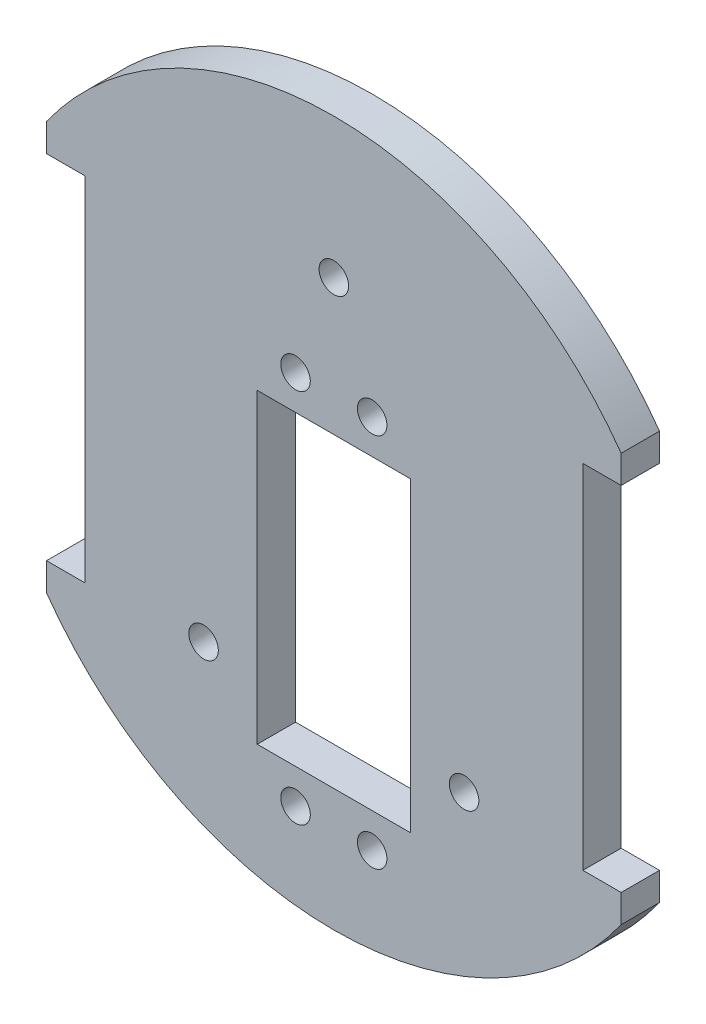
ISO-10303-21;
HEADER;
FILE_DESCRIPTION(('STEP AP214'),'2;1');
FILE_NAME('part.step','',(''),(''),'','','');
FILE_SCHEMA(('AUTOMOTIVE_DESIGN { 1 0 10303 214 1 1 1 1 }'));
ENDSEC;
DATA;
#1=APPLICATION_CONTEXT('core data for automotive mechanical design processes');
#2=APPLICATION_PROTOCOL_DEFINITION('international standard','automotive_design',2000,#1);
#3=PRODUCT_CONTEXT('',#1,'mechanical');
#4=PRODUCT('Part','Part','',(#3));
#5=PRODUCT_RELATED_PRODUCT_CATEGORY('part','',(#4));
#6=PRODUCT_DEFINITION_FORMATION('','',#4);
#7=PRODUCT_DEFINITION_CONTEXT('part definition',#1,'design');
#8=PRODUCT_DEFINITION('design','',#6,#7);
#9=PRODUCT_DEFINITION_SHAPE('','',#8);
#10=(LENGTH_UNIT() NAMED_UNIT(*) SI_UNIT(.MILLI.,.METRE.));
#11=(NAMED_UNIT(*) PLANE_ANGLE_UNIT() SI_UNIT($,.RADIAN.));
#12=(NAMED_UNIT(*) SI_UNIT($,.STERADIAN.) SOLID_ANGLE_UNIT());
#13=UNCERTAINTY_MEASURE_WITH_UNIT(LENGTH_MEASURE(1.E-05),#10,'distance_accuracy_value','');
#14=(GEOMETRIC_REPRESENTATION_CONTEXT(3) GLOBAL_UNCERTAINTY_ASSIGNED_CONTEXT((#13)) GLOBAL_UNIT_ASSIGNED_CONTEXT((#10,
#11,#12)) REPRESENTATION_CONTEXT('',''));
#15=CARTESIAN_POINT('',(0.,0.,0.));
#16=DIRECTION('',(0.,0.,1.));
#17=DIRECTION('',(1.,0.,0.));
#18=AXIS2_PLACEMENT_3D('',#15,#16,#17);
#19=CARTESIAN_POINT('',(0.,0.,0.));
#20=DIRECTION('',(0.,0.,1.));
#21=DIRECTION('',(1.,0.,0.));
#22=AXIS2_PLACEMENT_3D('',#19,#20,#21);
#23=PLANE('',#22);
#24=DIRECTION('',(1.,0.,0.));
#25=VECTOR('',#24,1.);
#26=CARTESIAN_POINT('',(10.,-30.,0.));
#27=LINE('',#26,#25);
#28=CARTESIAN_POINT('',(-10.,-30.,0.));
#29=VERTEX_POINT('',#28);
#30=CARTESIAN_POINT('',(10.,-30.,0.));
#31=VERTEX_POINT('',#30);
#32=EDGE_CURVE('E225',#29,#31,#27,.T.);
#33=ORIENTED_EDGE('',*,*,#32,.T.);
#34=DIRECTION('',(0.,1.,0.));
#35=VECTOR('',#34,1.);
#36=CARTESIAN_POINT('',(10.,10.,0.));
#37=LINE('',#36,#35);
#38=CARTESIAN_POINT('',(10.,10.,0.));
#39=VERTEX_POINT('',#38);
#40=EDGE_CURVE('E236',#31,#39,#37,.T.);
#41=ORIENTED_EDGE('',*,*,#40,.T.);
#42=DIRECTION('',(-1.,0.,0.));
#43=VECTOR('',#42,1.);
#44=CARTESIAN_POINT('',(10.,10.,0.));
#45=LINE('',#44,#43);
#46=CARTESIAN_POINT('',(-10.,10.,0.));
#47=VERTEX_POINT('',#46);
#48=EDGE_CURVE('E207',#39,#47,#45,.T.);
#49=ORIENTED_EDGE('',*,*,#48,.T.);
#50=DIRECTION('',(0.,-1.,0.));
#51=VECTOR('',#50,1.);
#52=CARTESIAN_POINT('',(-10.,10.,0.));
#53=LINE('',#52,#51);
#54=EDGE_CURVE('E220',#47,#29,#53,.T.);
#55=ORIENTED_EDGE('',*,*,#54,.T.);
#56=EDGE_LOOP('',(#33,#41,#49,#55));
#57=FACE_BOUND('',#56,.T.);
#58=DIRECTION('',(0.,1.,0.));
#59=VECTOR('',#58,1.);
#60=CARTESIAN_POINT('',(-32.5,23.,0.));
#61=LINE('',#60,#59);
#62=CARTESIAN_POINT('',(-32.5,23.,0.));
#63=VERTEX_POINT('',#62);
#64=CARTESIAN_POINT('',(-32.5,-23.,0.));
#65=VERTEX_POINT('',#64);
#66=EDGE_CURVE('E329',#63,#65,#61,.F.);
#67=ORIENTED_EDGE('',*,*,#66,.F.);
#68=DIRECTION('',(1.,0.,0.));
#69=VECTOR('',#68,1.);
#70=CARTESIAN_POINT('',(-32.5,23.,0.));
#71=LINE('',#70,#69);
#72=CARTESIAN_POINT('',(-37.5,23.,0.));
#73=VERTEX_POINT('',#72);
#74=EDGE_CURVE('E246',#73,#63,#71,.T.);
#75=ORIENTED_EDGE('',*,*,#74,.F.);
#76=DIRECTION('',(0.,1.,0.));
#77=VECTOR('',#76,1.);
#78=CARTESIAN_POINT('',(-37.5,35.,0.));
#79=LINE('',#78,#77);
#80=CARTESIAN_POINT('',(-37.5,26.6411336095144,0.));
#81=VERTEX_POINT('',#80);
#82=EDGE_CURVE('E239',#73,#81,#79,.T.);
#83=ORIENTED_EDGE('',*,*,#82,.T.);
#84=CARTESIAN_POINT('',(0.,0.,0.));
#85=DIRECTION('',(0.,0.,-1.));
#86=DIRECTION('',(-1.,0.,0.));
#87=AXIS2_PLACEMENT_3D('',#84,#85,#86);
#88=CIRCLE('',#87,46.);
#89=CARTESIAN_POINT('',(37.5,26.6411336095144,0.));
#90=VERTEX_POINT('',#89);
#91=EDGE_CURVE('E330',#90,#81,#88,.F.);
#92=ORIENTED_EDGE('',*,*,#91,.F.);
#93=DIRECTION('',(0.,-1.,0.));
#94=VECTOR('',#93,1.);
#95=CARTESIAN_POINT('',(37.5,35.,0.));
#96=LINE('',#95,#94);
#97=CARTESIAN_POINT('',(37.5,23.,0.));
#98=VERTEX_POINT('',#97);
#99=EDGE_CURVE('E251',#90,#98,#96,.T.);
#100=ORIENTED_EDGE('',*,*,#99,.T.);
#101=DIRECTION('',(1.,0.,0.));
#102=VECTOR('',#101,1.);
#103=CARTESIAN_POINT('',(32.5,23.,0.));
#104=LINE('',#103,#102);
#105=CARTESIAN_POINT('',(32.5,23.,0.));
#106=VERTEX_POINT('',#105);
#107=EDGE_CURVE('E254',#98,#106,#104,.F.);
#108=ORIENTED_EDGE('',*,*,#107,.T.);
#109=DIRECTION('',(0.,1.,0.));
#110=VECTOR('',#109,1.);
#111=CARTESIAN_POINT('',(32.5,23.,0.));
#112=LINE('',#111,#110);
#113=CARTESIAN_POINT('',(32.5,-23.,0.));
#114=VERTEX_POINT('',#113);
#115=EDGE_CURVE('E262',#106,#114,#112,.F.);
#116=ORIENTED_EDGE('',*,*,#115,.T.);
#117=DIRECTION('',(1.,0.,0.));
#118=VECTOR('',#117,1.);
#119=CARTESIAN_POINT('',(32.5,-23.,0.));
#120=LINE('',#119,#118);
#121=CARTESIAN_POINT('',(37.5,-23.,0.));
#122=VERTEX_POINT('',#121);
#123=EDGE_CURVE('E162',#114,#122,#120,.T.);
#124=ORIENTED_EDGE('',*,*,#123,.T.);
#125=DIRECTION('',(0.,-1.,0.));
#126=VECTOR('',#125,1.);
#127=CARTESIAN_POINT('',(37.5,35.,0.));
#128=LINE('',#127,#126);
#129=CARTESIAN_POINT('',(37.5,-26.6411336095144,0.));
#130=VERTEX_POINT('',#129);
#131=EDGE_CURVE('E158',#122,#130,#128,.T.);
#132=ORIENTED_EDGE('',*,*,#131,.T.);
#133=CARTESIAN_POINT('',(0.,0.,0.));
#134=DIRECTION('',(0.,0.,-1.));
#135=DIRECTION('',(-1.,0.,0.));
#136=AXIS2_PLACEMENT_3D('',#133,#134,#135);
#137=CIRCLE('',#136,46.);
#138=CARTESIAN_POINT('',(-37.5,-26.6411336095145,0.));
#139=VERTEX_POINT('',#138);
#140=EDGE_CURVE('E147',#139,#130,#137,.F.);
#141=ORIENTED_EDGE('',*,*,#140,.F.);
#142=DIRECTION('',(0.,1.,0.));
#143=VECTOR('',#142,1.);
#144=CARTESIAN_POINT('',(-37.5,35.,0.));
#145=LINE('',#144,#143);
#146=CARTESIAN_POINT('',(-37.5,-23.,0.));
#147=VERTEX_POINT('',#146);
#148=EDGE_CURVE('E142',#139,#147,#145,.T.);
#149=ORIENTED_EDGE('',*,*,#148,.T.);
#150=DIRECTION('',(1.,0.,0.));
#151=VECTOR('',#150,1.);
#152=CARTESIAN_POINT('',(-32.5,-23.,0.));
#153=LINE('',#152,#151);
#154=EDGE_CURVE('E200',#65,#147,#153,.F.);
#155=ORIENTED_EDGE('',*,*,#154,.F.);
#156=EDGE_LOOP('',(#67,#75,#83,#92,#100,#108,#116,#124,#132,#141,#149,#155));
#157=FACE_BOUND('',#156,.T.);
#158=CARTESIAN_POINT('',(0.,27.75,0.));
#159=DIRECTION('',(0.,0.,-1.));
#160=DIRECTION('',(-1.,0.,0.));
#161=AXIS2_PLACEMENT_3D('',#158,#159,#160);
#162=CIRCLE('',#161,1.925);
#163=CARTESIAN_POINT('',(-1.925,27.75,0.));
#164=VERTEX_POINT('',#163);
#165=EDGE_CURVE('E320',#164,#164,#162,.F.);
#166=ORIENTED_EDGE('',*,*,#165,.T.);
#167=EDGE_LOOP('',(#166));
#168=FACE_BOUND('',#167,.T.);
#169=CARTESIAN_POINT('',(17.,-21.9331370305299,0.));
#170=DIRECTION('',(0.,0.,-1.));
#171=DIRECTION('',(-1.,0.,0.));
#172=AXIS2_PLACEMENT_3D('',#169,#170,#171);
#173=CIRCLE('',#172,1.925);
#174=CARTESIAN_POINT('',(15.075,-21.9331370305299,0.));
#175=VERTEX_POINT('',#174);
#176=EDGE_CURVE('E323',#175,#175,#173,.F.);
#177=ORIENTED_EDGE('',*,*,#176,.T.);
#178=EDGE_LOOP('',(#177));
#179=FACE_BOUND('',#178,.T.);
#180=CARTESIAN_POINT('',(-17.,-21.9331370305299,0.));
#181=DIRECTION('',(0.,0.,-1.));
#182=DIRECTION('',(-1.,0.,0.));
#183=AXIS2_PLACEMENT_3D('',#180,#181,#182);
#184=CIRCLE('',#183,1.925);
#185=CARTESIAN_POINT('',(-18.925,-21.9331370305299,0.));
#186=VERTEX_POINT('',#185);
#187=EDGE_CURVE('E326',#186,#186,#184,.F.);
#188=ORIENTED_EDGE('',*,*,#187,.T.);
#189=EDGE_LOOP('',(#188));
#190=FACE_BOUND('',#189,.T.);
#191=CARTESIAN_POINT('',(5.,14.5,0.));
#192=DIRECTION('',(0.,0.,-1.));
#193=DIRECTION('',(-1.,0.,0.));
#194=AXIS2_PLACEMENT_3D('',#191,#192,#193);
#195=CIRCLE('',#194,1.925);
#196=CARTESIAN_POINT('',(3.075,14.5,0.));
#197=VERTEX_POINT('',#196);
#198=EDGE_CURVE('E201',#197,#197,#195,.F.);
#199=ORIENTED_EDGE('',*,*,#198,.T.);
#200=EDGE_LOOP('',(#199));
#201=FACE_BOUND('',#200,.T.);
#202=CARTESIAN_POINT('',(-5.,14.5,0.));
#203=DIRECTION('',(0.,0.,-1.));
#204=DIRECTION('',(-1.,0.,0.));
#205=AXIS2_PLACEMENT_3D('',#202,#203,#204);
#206=CIRCLE('',#205,1.925);
#207=CARTESIAN_POINT('',(-6.925,14.5,0.));
#208=VERTEX_POINT('',#207);
#209=EDGE_CURVE('E335',#208,#208,#206,.F.);
#210=ORIENTED_EDGE('',*,*,#209,.T.);
#211=EDGE_LOOP('',(#210));
#212=FACE_BOUND('',#211,.T.);
#213=CARTESIAN_POINT('',(5.,-34.5,0.));
#214=DIRECTION('',(0.,0.,-1.));
#215=DIRECTION('',(-1.,0.,0.));
#216=AXIS2_PLACEMENT_3D('',#213,#214,#215);
#217=CIRCLE('',#216,1.925);
#218=CARTESIAN_POINT('',(3.075,-34.5,0.));
#219=VERTEX_POINT('',#218);
#220=EDGE_CURVE('E338',#219,#219,#217,.F.);
#221=ORIENTED_EDGE('',*,*,#220,.T.);
#222=EDGE_LOOP('',(#221));
#223=FACE_BOUND('',#222,.T.);
#224=CARTESIAN_POINT('',(-5.,-34.5,0.));
#225=DIRECTION('',(0.,0.,-1.));
#226=DIRECTION('',(-1.,0.,0.));
#227=AXIS2_PLACEMENT_3D('',#224,#225,#226);
#228=CIRCLE('',#227,1.925);
#229=CARTESIAN_POINT('',(-6.925,-34.5,0.));
#230=VERTEX_POINT('',#229);
#231=EDGE_CURVE('E283',#230,#230,#228,.F.);
#232=ORIENTED_EDGE('',*,*,#231,.T.);
#233=EDGE_LOOP('',(#232));
#234=FACE_BOUND('',#233,.T.);
#235=ADVANCED_FACE('F33',(#57,#157,#168,#179,#190,#201,#212,#223,#234),#23,.F.);
#236=CARTESIAN_POINT('',(10.,10.,10.));
#237=DIRECTION('',(1.,0.,0.));
#238=DIRECTION('',(0.,1.,0.));
#239=AXIS2_PLACEMENT_3D('',#236,#237,#238);
#240=PLANE('',#239);
#241=DIRECTION('',(0.,0.,1.));
#242=VECTOR('',#241,1.);
#243=CARTESIAN_POINT('',(10.,10.,10.));
#244=LINE('',#243,#242);
#245=CARTESIAN_POINT('',(10.,10.,5.));
#246=VERTEX_POINT('',#245);
#247=EDGE_CURVE('E226',#39,#246,#244,.T.);
#248=ORIENTED_EDGE('',*,*,#247,.F.);
#249=ORIENTED_EDGE('',*,*,#40,.F.);
#250=DIRECTION('',(0.,0.,1.));
#251=VECTOR('',#250,1.);
#252=CARTESIAN_POINT('',(10.,-30.,10.));
#253=LINE('',#252,#251);
#254=CARTESIAN_POINT('',(10.,-30.,5.));
#255=VERTEX_POINT('',#254);
#256=EDGE_CURVE('E223',#31,#255,#253,.T.);
#257=ORIENTED_EDGE('',*,*,#256,.T.);
#258=DIRECTION('',(0.,1.,0.));
#259=VECTOR('',#258,1.);
#260=CARTESIAN_POINT('',(10.,0.,5.));
#261=LINE('',#260,#259);
#262=EDGE_CURVE('E229',#246,#255,#261,.F.);
#263=ORIENTED_EDGE('',*,*,#262,.F.);
#264=EDGE_LOOP('',(#248,#249,#257,#263));
#265=FACE_BOUND('',#264,.T.);
#266=ADVANCED_FACE('F519',(#265),#240,.F.);
#267=CARTESIAN_POINT('',(10.,-30.,10.));
#268=DIRECTION('',(0.,-1.,0.));
#269=DIRECTION('',(1.,0.,0.));
#270=AXIS2_PLACEMENT_3D('',#267,#268,#269);
#271=PLANE('',#270);
#272=DIRECTION('',(0.,0.,1.));
#273=VECTOR('',#272,1.);
#274=CARTESIAN_POINT('',(-10.,-30.,10.));
#275=LINE('',#274,#273);
#276=CARTESIAN_POINT('',(-10.,-30.,5.));
#277=VERTEX_POINT('',#276);
#278=EDGE_CURVE('E208',#29,#277,#275,.T.);
#279=ORIENTED_EDGE('',*,*,#278,.T.);
#280=DIRECTION('',(1.,0.,0.));
#281=VECTOR('',#280,1.);
#282=CARTESIAN_POINT('',(0.,-30.,5.));
#283=LINE('',#282,#281);
#284=EDGE_CURVE('E215',#255,#277,#283,.F.);
#285=ORIENTED_EDGE('',*,*,#284,.F.);
#286=ORIENTED_EDGE('',*,*,#256,.F.);
#287=ORIENTED_EDGE('',*,*,#32,.F.);
#288=EDGE_LOOP('',(#279,#285,#286,#287));
#289=FACE_BOUND('',#288,.T.);
#290=ADVANCED_FACE('F530',(#289),#271,.F.);
#291=CARTESIAN_POINT('',(-10.,10.,10.));
#292=DIRECTION('',(-1.,0.,0.));
#293=DIRECTION('',(0.,-1.,0.));
#294=AXIS2_PLACEMENT_3D('',#291,#292,#293);
#295=PLANE('',#294);
#296=ORIENTED_EDGE('',*,*,#278,.F.);
#297=ORIENTED_EDGE('',*,*,#54,.F.);
#298=DIRECTION('',(0.,0.,1.));
#299=VECTOR('',#298,1.);
#300=CARTESIAN_POINT('',(-10.,10.,10.));
#301=LINE('',#300,#299);
#302=CARTESIAN_POINT('',(-10.,10.,5.));
#303=VERTEX_POINT('',#302);
#304=EDGE_CURVE('E204',#47,#303,#301,.T.);
#305=ORIENTED_EDGE('',*,*,#304,.T.);
#306=DIRECTION('',(0.,1.,0.));
#307=VECTOR('',#306,1.);
#308=CARTESIAN_POINT('',(-10.,0.,5.));
#309=LINE('',#308,#307);
#310=EDGE_CURVE('E211',#277,#303,#309,.T.);
#311=ORIENTED_EDGE('',*,*,#310,.F.);
#312=EDGE_LOOP('',(#296,#297,#305,#311));
#313=FACE_BOUND('',#312,.T.);
#314=ADVANCED_FACE('F535',(#313),#295,.F.);
#315=CARTESIAN_POINT('',(10.,10.,10.));
#316=DIRECTION('',(0.,1.,0.));
#317=DIRECTION('',(-1.,0.,0.));
#318=AXIS2_PLACEMENT_3D('',#315,#316,#317);
#319=PLANE('',#318);
#320=ORIENTED_EDGE('',*,*,#48,.F.);
#321=ORIENTED_EDGE('',*,*,#247,.T.);
#322=DIRECTION('',(1.,0.,0.));
#323=VECTOR('',#322,1.);
#324=CARTESIAN_POINT('',(0.,10.,5.));
#325=LINE('',#324,#323);
#326=EDGE_CURVE('E232',#303,#246,#325,.T.);
#327=ORIENTED_EDGE('',*,*,#326,.F.);
#328=ORIENTED_EDGE('',*,*,#304,.F.);
#329=EDGE_LOOP('',(#320,#321,#327,#328));
#330=FACE_BOUND('',#329,.T.);
#331=ADVANCED_FACE('F546',(#330),#319,.F.);
#332=CARTESIAN_POINT('',(-5.,-34.5,10.));
#333=DIRECTION('',(0.,0.,-1.));
#334=DIRECTION('',(-1.,0.,0.));
#335=AXIS2_PLACEMENT_3D('',#332,#333,#334);
#336=CYLINDRICAL_SURFACE('',#335,1.925);
#337=CARTESIAN_POINT('',(-5.,-34.5,5.));
#338=DIRECTION('',(0.,0.,-1.));
#339=DIRECTION('',(-1.,0.,0.));
#340=AXIS2_PLACEMENT_3D('',#337,#338,#339);
#341=CIRCLE('',#340,1.925);
#342=CARTESIAN_POINT('',(-6.925,-34.5,5.));
#343=VERTEX_POINT('',#342);
#344=EDGE_CURVE('E214',#343,#343,#341,.T.);
#345=ORIENTED_EDGE('',*,*,#344,.F.);
#346=EDGE_LOOP('',(#345));
#347=FACE_BOUND('',#346,.T.);
#348=ORIENTED_EDGE('',*,*,#231,.F.);
#349=EDGE_LOOP('',(#348));
#350=FACE_BOUND('',#349,.T.);
#351=ADVANCED_FACE('F551',(#347,#350),#336,.F.);
#352=CARTESIAN_POINT('',(5.,-34.5,10.));
#353=DIRECTION('',(0.,0.,-1.));
#354=DIRECTION('',(-1.,0.,0.));
#355=AXIS2_PLACEMENT_3D('',#352,#353,#354);
#356=CYLINDRICAL_SURFACE('',#355,1.925);
#357=CARTESIAN_POINT('',(5.,-34.5,5.));
#358=DIRECTION('',(0.,0.,-1.));
#359=DIRECTION('',(-1.,0.,0.));
#360=AXIS2_PLACEMENT_3D('',#357,#358,#359);
#361=CIRCLE('',#360,1.925);
#362=CARTESIAN_POINT('',(3.075,-34.5,5.));
#363=VERTEX_POINT('',#362);
#364=EDGE_CURVE('E315',#363,#363,#361,.T.);
#365=ORIENTED_EDGE('',*,*,#364,.F.);
#366=EDGE_LOOP('',(#365));
#367=FACE_BOUND('',#366,.T.);
#368=ORIENTED_EDGE('',*,*,#220,.F.);
#369=EDGE_LOOP('',(#368));
#370=FACE_BOUND('',#369,.T.);
#371=ADVANCED_FACE('F590',(#367,#370),#356,.F.);
#372=CARTESIAN_POINT('',(-5.,14.5,10.));
#373=DIRECTION('',(0.,0.,-1.));
#374=DIRECTION('',(-1.,0.,0.));
#375=AXIS2_PLACEMENT_3D('',#372,#373,#374);
#376=CYLINDRICAL_SURFACE('',#375,1.925);
#377=CARTESIAN_POINT('',(-5.,14.5,5.));
#378=DIRECTION('',(0.,0.,-1.));
#379=DIRECTION('',(-1.,0.,0.));
#380=AXIS2_PLACEMENT_3D('',#377,#378,#379);
#381=CIRCLE('',#380,1.925);
#382=CARTESIAN_POINT('',(-6.925,14.5,5.));
#383=VERTEX_POINT('',#382);
#384=EDGE_CURVE('E312',#383,#383,#381,.T.);
#385=ORIENTED_EDGE('',*,*,#384,.F.);
#386=EDGE_LOOP('',(#385));
#387=FACE_BOUND('',#386,.T.);
#388=ORIENTED_EDGE('',*,*,#209,.F.);
#389=EDGE_LOOP('',(#388));
#390=FACE_BOUND('',#389,.T.);
#391=ADVANCED_FACE('F584',(#387,#390),#376,.F.);
#392=CARTESIAN_POINT('',(5.,14.5,10.));
#393=DIRECTION('',(0.,0.,-1.));
#394=DIRECTION('',(-1.,0.,0.));
#395=AXIS2_PLACEMENT_3D('',#392,#393,#394);
#396=CYLINDRICAL_SURFACE('',#395,1.925);
#397=CARTESIAN_POINT('',(5.,14.5,5.));
#398=DIRECTION('',(0.,0.,-1.));
#399=DIRECTION('',(-1.,0.,0.));
#400=AXIS2_PLACEMENT_3D('',#397,#398,#399);
#401=CIRCLE('',#400,1.925);
#402=CARTESIAN_POINT('',(3.075,14.5,5.));
#403=VERTEX_POINT('',#402);
#404=EDGE_CURVE('E309',#403,#403,#401,.T.);
#405=ORIENTED_EDGE('',*,*,#404,.F.);
#406=EDGE_LOOP('',(#405));
#407=FACE_BOUND('',#406,.T.);
#408=ORIENTED_EDGE('',*,*,#198,.F.);
#409=EDGE_LOOP('',(#408));
#410=FACE_BOUND('',#409,.T.);
#411=ADVANCED_FACE('F589',(#407,#410),#396,.F.);
#412=CARTESIAN_POINT('',(-32.5,-23.,-2.));
#413=DIRECTION('',(0.,1.,0.));
#414=DIRECTION('',(0.,0.,1.));
#415=AXIS2_PLACEMENT_3D('',#412,#413,#414);
#416=PLANE('',#415);
#417=DIRECTION('',(0.,0.,1.));
#418=VECTOR('',#417,1.);
#419=CARTESIAN_POINT('',(-32.5,-23.,-2.));
#420=LINE('',#419,#418);
#421=CARTESIAN_POINT('',(-32.5,-23.,5.));
#422=VERTEX_POINT('',#421);
#423=EDGE_CURVE('E197',#422,#65,#420,.F.);
#424=ORIENTED_EDGE('',*,*,#423,.T.);
#425=ORIENTED_EDGE('',*,*,#154,.T.);
#426=DIRECTION('',(0.,0.,1.));
#427=VECTOR('',#426,1.);
#428=CARTESIAN_POINT('',(-37.5,-23.,-2.));
#429=LINE('',#428,#427);
#430=CARTESIAN_POINT('',(-37.5,-23.,5.));
#431=VERTEX_POINT('',#430);
#432=EDGE_CURVE('E187',#147,#431,#429,.T.);
#433=ORIENTED_EDGE('',*,*,#432,.T.);
#434=DIRECTION('',(1.,0.,0.));
#435=VECTOR('',#434,1.);
#436=CARTESIAN_POINT('',(0.,-23.,5.));
#437=LINE('',#436,#435);
#438=EDGE_CURVE('E191',#422,#431,#437,.F.);
#439=ORIENTED_EDGE('',*,*,#438,.F.);
#440=EDGE_LOOP('',(#424,#425,#433,#439));
#441=FACE_BOUND('',#440,.T.);
#442=ADVANCED_FACE('F601',(#441),#416,.T.);
#443=CARTESIAN_POINT('',(-37.5,35.,-2.));
#444=DIRECTION('',(1.,0.,0.));
#445=DIRECTION('',(0.,1.,0.));
#446=AXIS2_PLACEMENT_3D('',#443,#444,#445);
#447=PLANE('',#446);
#448=ORIENTED_EDGE('',*,*,#432,.F.);
#449=ORIENTED_EDGE('',*,*,#148,.F.);
#450=DIRECTION('',(0.,0.,-1.));
#451=VECTOR('',#450,1.);
#452=CARTESIAN_POINT('',(-37.5,-26.6411336095145,5.));
#453=LINE('',#452,#451);
#454=CARTESIAN_POINT('',(-37.5,-26.6411336095145,5.));
#455=VERTEX_POINT('',#454);
#456=EDGE_CURVE('E154',#455,#139,#453,.T.);
#457=ORIENTED_EDGE('',*,*,#456,.F.);
#458=DIRECTION('',(0.,1.,0.));
#459=VECTOR('',#458,1.);
#460=CARTESIAN_POINT('',(-37.5,0.,5.));
#461=LINE('',#460,#459);
#462=EDGE_CURVE('E194',#431,#455,#461,.F.);
#463=ORIENTED_EDGE('',*,*,#462,.F.);
#464=EDGE_LOOP('',(#448,#449,#457,#463));
#465=FACE_BOUND('',#464,.T.);
#466=ADVANCED_FACE('F611',(#465),#447,.F.);
#467=CARTESIAN_POINT('',(0.,0.,5.));
#468=DIRECTION('',(0.,0.,-1.));
#469=DIRECTION('',(-1.,0.,0.));
#470=AXIS2_PLACEMENT_3D('',#467,#468,#469);
#471=CYLINDRICAL_SURFACE('',#470,46.);
#472=ORIENTED_EDGE('',*,*,#140,.T.);
#473=DIRECTION('',(0.,0.,1.));
#474=VECTOR('',#473,1.);
#475=CARTESIAN_POINT('',(37.5,-26.6411336095144,-2.));
#476=LINE('',#475,#474);
#477=CARTESIAN_POINT('',(37.5,-26.6411336095144,5.));
#478=VERTEX_POINT('',#477);
#479=EDGE_CURVE('E152',#130,#478,#476,.T.);
#480=ORIENTED_EDGE('',*,*,#479,.T.);
#481=CARTESIAN_POINT('',(0.,0.,5.));
#482=DIRECTION('',(0.,0.,-1.));
#483=DIRECTION('',(-1.,0.,0.));
#484=AXIS2_PLACEMENT_3D('',#481,#482,#483);
#485=CIRCLE('',#484,46.);
#486=EDGE_CURVE('E307',#455,#478,#485,.F.);
#487=ORIENTED_EDGE('',*,*,#486,.F.);
#488=ORIENTED_EDGE('',*,*,#456,.T.);
#489=EDGE_LOOP('',(#472,#480,#487,#488));
#490=FACE_BOUND('',#489,.T.);
#491=ADVANCED_FACE('F149',(#490),#471,.T.);
#492=CARTESIAN_POINT('',(37.5,35.,-2.));
#493=DIRECTION('',(-1.,0.,0.));
#494=DIRECTION('',(0.,-1.,0.));
#495=AXIS2_PLACEMENT_3D('',#492,#493,#494);
#496=PLANE('',#495);
#497=DIRECTION('',(0.,0.,-1.));
#498=VECTOR('',#497,1.);
#499=CARTESIAN_POINT('',(37.5,-23.,-2.));
#500=LINE('',#499,#498);
#501=CARTESIAN_POINT('',(37.5,-23.,5.));
#502=VERTEX_POINT('',#501);
#503=EDGE_CURVE('E181',#122,#502,#500,.F.);
#504=ORIENTED_EDGE('',*,*,#503,.T.);
#505=DIRECTION('',(0.,1.,0.));
#506=VECTOR('',#505,1.);
#507=CARTESIAN_POINT('',(37.5,0.,5.));
#508=LINE('',#507,#506);
#509=EDGE_CURVE('E168',#478,#502,#508,.T.);
#510=ORIENTED_EDGE('',*,*,#509,.F.);
#511=ORIENTED_EDGE('',*,*,#479,.F.);
#512=ORIENTED_EDGE('',*,*,#131,.F.);
#513=EDGE_LOOP('',(#504,#510,#511,#512));
#514=FACE_BOUND('',#513,.T.);
#515=ADVANCED_FACE('F166',(#514),#496,.F.);
#516=CARTESIAN_POINT('',(32.5,-23.,-2.));
#517=DIRECTION('',(0.,-1.,0.));
#518=DIRECTION('',(0.,0.,-1.));
#519=AXIS2_PLACEMENT_3D('',#516,#517,#518);
#520=PLANE('',#519);
#521=ORIENTED_EDGE('',*,*,#503,.F.);
#522=ORIENTED_EDGE('',*,*,#123,.F.);
#523=DIRECTION('',(0.,0.,1.));
#524=VECTOR('',#523,1.);
#525=CARTESIAN_POINT('',(32.5,-23.,-2.));
#526=LINE('',#525,#524);
#527=CARTESIAN_POINT('',(32.5,-23.,5.));
#528=VERTEX_POINT('',#527);
#529=EDGE_CURVE('E183',#114,#528,#526,.T.);
#530=ORIENTED_EDGE('',*,*,#529,.T.);
#531=DIRECTION('',(1.,0.,0.));
#532=VECTOR('',#531,1.);
#533=CARTESIAN_POINT('',(0.,-23.,5.));
#534=LINE('',#533,#532);
#535=EDGE_CURVE('E175',#502,#528,#534,.F.);
#536=ORIENTED_EDGE('',*,*,#535,.F.);
#537=EDGE_LOOP('',(#521,#522,#530,#536));
#538=FACE_BOUND('',#537,.T.);
#539=ADVANCED_FACE('F390',(#538),#520,.F.);
#540=CARTESIAN_POINT('',(32.5,23.,-2.));
#541=DIRECTION('',(-1.,0.,0.));
#542=DIRECTION('',(0.,0.,1.));
#543=AXIS2_PLACEMENT_3D('',#540,#541,#542);
#544=PLANE('',#543);
#545=ORIENTED_EDGE('',*,*,#115,.F.);
#546=DIRECTION('',(0.,0.,1.));
#547=VECTOR('',#546,1.);
#548=CARTESIAN_POINT('',(32.5,23.,-2.));
#549=LINE('',#548,#547);
#550=CARTESIAN_POINT('',(32.5,23.,5.));
#551=VERTEX_POINT('',#550);
#552=EDGE_CURVE('E259',#106,#551,#549,.T.);
#553=ORIENTED_EDGE('',*,*,#552,.T.);
#554=DIRECTION('',(0.,1.,0.));
#555=VECTOR('',#554,1.);
#556=CARTESIAN_POINT('',(32.5,0.,5.));
#557=LINE('',#556,#555);
#558=EDGE_CURVE('E178',#528,#551,#557,.T.);
#559=ORIENTED_EDGE('',*,*,#558,.F.);
#560=ORIENTED_EDGE('',*,*,#529,.F.);
#561=EDGE_LOOP('',(#545,#553,#559,#560));
#562=FACE_BOUND('',#561,.T.);
#563=ADVANCED_FACE('F377',(#562),#544,.F.);
#564=CARTESIAN_POINT('',(32.5,23.,-2.));
#565=DIRECTION('',(0.,1.,0.));
#566=DIRECTION('',(0.,0.,1.));
#567=AXIS2_PLACEMENT_3D('',#564,#565,#566);
#568=PLANE('',#567);
#569=DIRECTION('',(0.,0.,1.));
#570=VECTOR('',#569,1.);
#571=CARTESIAN_POINT('',(37.5,23.,-2.));
#572=LINE('',#571,#570);
#573=CARTESIAN_POINT('',(37.5,23.,5.));
#574=VERTEX_POINT('',#573);
#575=EDGE_CURVE('E253',#98,#574,#572,.T.);
#576=ORIENTED_EDGE('',*,*,#575,.T.);
#577=DIRECTION('',(1.,0.,0.));
#578=VECTOR('',#577,1.);
#579=CARTESIAN_POINT('',(0.,23.,5.));
#580=LINE('',#579,#578);
#581=EDGE_CURVE('E344',#551,#574,#580,.T.);
#582=ORIENTED_EDGE('',*,*,#581,.F.);
#583=ORIENTED_EDGE('',*,*,#552,.F.);
#584=ORIENTED_EDGE('',*,*,#107,.F.);
#585=EDGE_LOOP('',(#576,#582,#583,#584));
#586=FACE_BOUND('',#585,.T.);
#587=ADVANCED_FACE('F381',(#586),#568,.F.);
#588=CARTESIAN_POINT('',(37.5,35.,-2.));
#589=DIRECTION('',(-1.,0.,0.));
#590=DIRECTION('',(0.,-1.,0.));
#591=AXIS2_PLACEMENT_3D('',#588,#589,#590);
#592=PLANE('',#591);
#593=ORIENTED_EDGE('',*,*,#575,.F.);
#594=ORIENTED_EDGE('',*,*,#99,.F.);
#595=DIRECTION('',(0.,0.,-1.));
#596=VECTOR('',#595,1.);
#597=CARTESIAN_POINT('',(37.5,26.6411336095144,5.));
#598=LINE('',#597,#596);
#599=CARTESIAN_POINT('',(37.5,26.6411336095144,5.));
#600=VERTEX_POINT('',#599);
#601=EDGE_CURVE('E331',#600,#90,#598,.T.);
#602=ORIENTED_EDGE('',*,*,#601,.F.);
#603=DIRECTION('',(0.,1.,0.));
#604=VECTOR('',#603,1.);
#605=CARTESIAN_POINT('',(37.5,0.,5.));
#606=LINE('',#605,#604);
#607=EDGE_CURVE('E306',#574,#600,#606,.T.);
#608=ORIENTED_EDGE('',*,*,#607,.F.);
#609=EDGE_LOOP('',(#593,#594,#602,#608));
#610=FACE_BOUND('',#609,.T.);
#611=ADVANCED_FACE('F431',(#610),#592,.F.);
#612=CARTESIAN_POINT('',(0.,0.,5.));
#613=DIRECTION('',(0.,0.,-1.));
#614=DIRECTION('',(-1.,0.,0.));
#615=AXIS2_PLACEMENT_3D('',#612,#613,#614);
#616=CYLINDRICAL_SURFACE('',#615,46.);
#617=CARTESIAN_POINT('',(0.,0.,5.));
#618=DIRECTION('',(0.,0.,-1.));
#619=DIRECTION('',(-1.,0.,0.));
#620=AXIS2_PLACEMENT_3D('',#617,#618,#619);
#621=CIRCLE('',#620,46.);
#622=CARTESIAN_POINT('',(-37.5,26.6411336095144,5.));
#623=VERTEX_POINT('',#622);
#624=EDGE_CURVE('E302',#600,#623,#621,.F.);
#625=ORIENTED_EDGE('',*,*,#624,.F.);
#626=ORIENTED_EDGE('',*,*,#601,.T.);
#627=ORIENTED_EDGE('',*,*,#91,.T.);
#628=DIRECTION('',(0.,0.,1.));
#629=VECTOR('',#628,1.);
#630=CARTESIAN_POINT('',(-37.5,26.6411336095144,-2.));
#631=LINE('',#630,#629);
#632=EDGE_CURVE('E243',#81,#623,#631,.T.);
#633=ORIENTED_EDGE('',*,*,#632,.T.);
#634=EDGE_LOOP('',(#625,#626,#627,#633));
#635=FACE_BOUND('',#634,.T.);
#636=ADVANCED_FACE('F427',(#635),#616,.T.);
#637=CARTESIAN_POINT('',(-37.5,35.,-2.));
#638=DIRECTION('',(1.,0.,0.));
#639=DIRECTION('',(0.,1.,0.));
#640=AXIS2_PLACEMENT_3D('',#637,#638,#639);
#641=PLANE('',#640);
#642=DIRECTION('',(0.,0.,-1.));
#643=VECTOR('',#642,1.);
#644=CARTESIAN_POINT('',(-37.5,23.,-2.));
#645=LINE('',#644,#643);
#646=CARTESIAN_POINT('',(-37.5,23.,5.));
#647=VERTEX_POINT('',#646);
#648=EDGE_CURVE('E242',#647,#73,#645,.T.);
#649=ORIENTED_EDGE('',*,*,#648,.F.);
#650=DIRECTION('',(0.,1.,0.));
#651=VECTOR('',#650,1.);
#652=CARTESIAN_POINT('',(-37.5,0.,5.));
#653=LINE('',#652,#651);
#654=EDGE_CURVE('E305',#623,#647,#653,.F.);
#655=ORIENTED_EDGE('',*,*,#654,.F.);
#656=ORIENTED_EDGE('',*,*,#632,.F.);
#657=ORIENTED_EDGE('',*,*,#82,.F.);
#658=EDGE_LOOP('',(#649,#655,#656,#657));
#659=FACE_BOUND('',#658,.T.);
#660=ADVANCED_FACE('F423',(#659),#641,.F.);
#661=CARTESIAN_POINT('',(-32.5,23.,-2.));
#662=DIRECTION('',(0.,-1.,0.));
#663=DIRECTION('',(0.,0.,-1.));
#664=AXIS2_PLACEMENT_3D('',#661,#662,#663);
#665=PLANE('',#664);
#666=DIRECTION('',(0.,0.,1.));
#667=VECTOR('',#666,1.);
#668=CARTESIAN_POINT('',(-32.5,23.,-2.));
#669=LINE('',#668,#667);
#670=CARTESIAN_POINT('',(-32.5,23.,5.));
#671=VERTEX_POINT('',#670);
#672=EDGE_CURVE('E248',#671,#63,#669,.F.);
#673=ORIENTED_EDGE('',*,*,#672,.F.);
#674=DIRECTION('',(1.,0.,0.));
#675=VECTOR('',#674,1.);
#676=CARTESIAN_POINT('',(0.,23.,5.));
#677=LINE('',#676,#675);
#678=EDGE_CURVE('E301',#647,#671,#677,.T.);
#679=ORIENTED_EDGE('',*,*,#678,.F.);
#680=ORIENTED_EDGE('',*,*,#648,.T.);
#681=ORIENTED_EDGE('',*,*,#74,.T.);
#682=EDGE_LOOP('',(#673,#679,#680,#681));
#683=FACE_BOUND('',#682,.T.);
#684=ADVANCED_FACE('F420',(#683),#665,.T.);
#685=CARTESIAN_POINT('',(-32.5,23.,-2.));
#686=DIRECTION('',(-1.,0.,0.));
#687=DIRECTION('',(0.,0.,1.));
#688=AXIS2_PLACEMENT_3D('',#685,#686,#687);
#689=PLANE('',#688);
#690=ORIENTED_EDGE('',*,*,#672,.T.);
#691=ORIENTED_EDGE('',*,*,#66,.T.);
#692=ORIENTED_EDGE('',*,*,#423,.F.);
#693=DIRECTION('',(0.,1.,0.));
#694=VECTOR('',#693,1.);
#695=CARTESIAN_POINT('',(-32.5,0.,5.));
#696=LINE('',#695,#694);
#697=EDGE_CURVE('E51',#671,#422,#696,.F.);
#698=ORIENTED_EDGE('',*,*,#697,.F.);
#699=EDGE_LOOP('',(#690,#691,#692,#698));
#700=FACE_BOUND('',#699,.T.);
#701=ADVANCED_FACE('F416',(#700),#689,.T.);
#702=CARTESIAN_POINT('',(-17.,-21.9331370305299,7.));
#703=DIRECTION('',(0.,0.,-1.));
#704=DIRECTION('',(-1.,0.,0.));
#705=AXIS2_PLACEMENT_3D('',#702,#703,#704);
#706=CYLINDRICAL_SURFACE('',#705,1.925);
#707=CARTESIAN_POINT('',(-17.,-21.9331370305299,5.));
#708=DIRECTION('',(0.,0.,-1.));
#709=DIRECTION('',(-1.,0.,0.));
#710=AXIS2_PLACEMENT_3D('',#707,#708,#709);
#711=CIRCLE('',#710,1.925);
#712=CARTESIAN_POINT('',(-18.925,-21.9331370305299,5.));
#713=VERTEX_POINT('',#712);
#714=EDGE_CURVE('E298',#713,#713,#711,.T.);
#715=ORIENTED_EDGE('',*,*,#714,.F.);
#716=EDGE_LOOP('',(#715));
#717=FACE_BOUND('',#716,.T.);
#718=ORIENTED_EDGE('',*,*,#187,.F.);
#719=EDGE_LOOP('',(#718));
#720=FACE_BOUND('',#719,.T.);
#721=ADVANCED_FACE('F412',(#717,#720),#706,.F.);
#722=CARTESIAN_POINT('',(17.,-21.9331370305299,7.));
#723=DIRECTION('',(0.,0.,-1.));
#724=DIRECTION('',(-1.,0.,0.));
#725=AXIS2_PLACEMENT_3D('',#722,#723,#724);
#726=CYLINDRICAL_SURFACE('',#725,1.925);
#727=CARTESIAN_POINT('',(17.,-21.9331370305299,5.));
#728=DIRECTION('',(0.,0.,-1.));
#729=DIRECTION('',(-1.,0.,0.));
#730=AXIS2_PLACEMENT_3D('',#727,#728,#729);
#731=CIRCLE('',#730,1.925);
#732=CARTESIAN_POINT('',(15.075,-21.9331370305299,5.));
#733=VERTEX_POINT('',#732);
#734=EDGE_CURVE('E42',#733,#733,#731,.T.);
#735=ORIENTED_EDGE('',*,*,#734,.F.);
#736=EDGE_LOOP('',(#735));
#737=FACE_BOUND('',#736,.T.);
#738=ORIENTED_EDGE('',*,*,#176,.F.);
#739=EDGE_LOOP('',(#738));
#740=FACE_BOUND('',#739,.T.);
#741=ADVANCED_FACE('F406',(#737,#740),#726,.F.);
#742=CARTESIAN_POINT('',(0.,27.75,7.));
#743=DIRECTION('',(0.,0.,-1.));
#744=DIRECTION('',(-1.,0.,0.));
#745=AXIS2_PLACEMENT_3D('',#742,#743,#744);
#746=CYLINDRICAL_SURFACE('',#745,1.925);
#747=CARTESIAN_POINT('',(0.,27.75,5.));
#748=DIRECTION('',(0.,0.,-1.));
#749=DIRECTION('',(-1.,0.,0.));
#750=AXIS2_PLACEMENT_3D('',#747,#748,#749);
#751=CIRCLE('',#750,1.925);
#752=CARTESIAN_POINT('',(-1.925,27.75,5.));
#753=VERTEX_POINT('',#752);
#754=EDGE_CURVE('E11',#753,#753,#751,.T.);
#755=ORIENTED_EDGE('',*,*,#754,.F.);
#756=EDGE_LOOP('',(#755));
#757=FACE_BOUND('',#756,.T.);
#758=ORIENTED_EDGE('',*,*,#165,.F.);
#759=EDGE_LOOP('',(#758));
#760=FACE_BOUND('',#759,.T.);
#761=ADVANCED_FACE('F400',(#757,#760),#746,.F.);
#762=CARTESIAN_POINT('',(0.,0.,5.));
#763=DIRECTION('',(0.,0.,1.));
#764=DIRECTION('',(1.,0.,0.));
#765=AXIS2_PLACEMENT_3D('',#762,#763,#764);
#766=PLANE('',#765);
#767=ORIENTED_EDGE('',*,*,#284,.T.);
#768=ORIENTED_EDGE('',*,*,#310,.T.);
#769=ORIENTED_EDGE('',*,*,#326,.T.);
#770=ORIENTED_EDGE('',*,*,#262,.T.);
#771=EDGE_LOOP('',(#767,#768,#769,#770));
#772=FACE_BOUND('',#771,.T.);
#773=ORIENTED_EDGE('',*,*,#678,.T.);
#774=ORIENTED_EDGE('',*,*,#697,.T.);
#775=ORIENTED_EDGE('',*,*,#438,.T.);
#776=ORIENTED_EDGE('',*,*,#462,.T.);
#777=ORIENTED_EDGE('',*,*,#486,.T.);
#778=ORIENTED_EDGE('',*,*,#509,.T.);
#779=ORIENTED_EDGE('',*,*,#535,.T.);
#780=ORIENTED_EDGE('',*,*,#558,.T.);
#781=ORIENTED_EDGE('',*,*,#581,.T.);
#782=ORIENTED_EDGE('',*,*,#607,.T.);
#783=ORIENTED_EDGE('',*,*,#624,.T.);
#784=ORIENTED_EDGE('',*,*,#654,.T.);
#785=EDGE_LOOP('',(#773,#774,#775,#776,#777,#778,#779,#780,#781,#782,#783,#784));
#786=FACE_BOUND('',#785,.T.);
#787=ORIENTED_EDGE('',*,*,#754,.T.);
#788=EDGE_LOOP('',(#787));
#789=FACE_BOUND('',#788,.T.);
#790=ORIENTED_EDGE('',*,*,#734,.T.);
#791=EDGE_LOOP('',(#790));
#792=FACE_BOUND('',#791,.T.);
#793=ORIENTED_EDGE('',*,*,#714,.T.);
#794=EDGE_LOOP('',(#793));
#795=FACE_BOUND('',#794,.T.);
#796=ORIENTED_EDGE('',*,*,#404,.T.);
#797=EDGE_LOOP('',(#796));
#798=FACE_BOUND('',#797,.T.);
#799=ORIENTED_EDGE('',*,*,#384,.T.);
#800=EDGE_LOOP('',(#799));
#801=FACE_BOUND('',#800,.T.);
#802=ORIENTED_EDGE('',*,*,#364,.T.);
#803=EDGE_LOOP('',(#802));
#804=FACE_BOUND('',#803,.T.);
#805=ORIENTED_EDGE('',*,*,#344,.T.);
#806=EDGE_LOOP('',(#805));
#807=FACE_BOUND('',#806,.T.);
#808=ADVANCED_FACE('F386',(#772,#786,#789,#792,#795,#798,#801,#804,#807),#766,.T.);
#809=CLOSED_SHELL('',(#235,#266,#290,#314,#331,#351,#371,#391,#411,#442,#466,#491,#515,#539,
#563,#587,#611,#636,#660,#684,#701,#721,#741,#761,#808));
#810=MANIFOLD_SOLID_BREP('B2',#809);
#811=ADVANCED_BREP_SHAPE_REPRESENTATION('',(#18,#810),#14);
#812=SHAPE_DEFINITION_REPRESENTATION(#9,#811);
ENDSEC;
END-ISO-10303-21;
